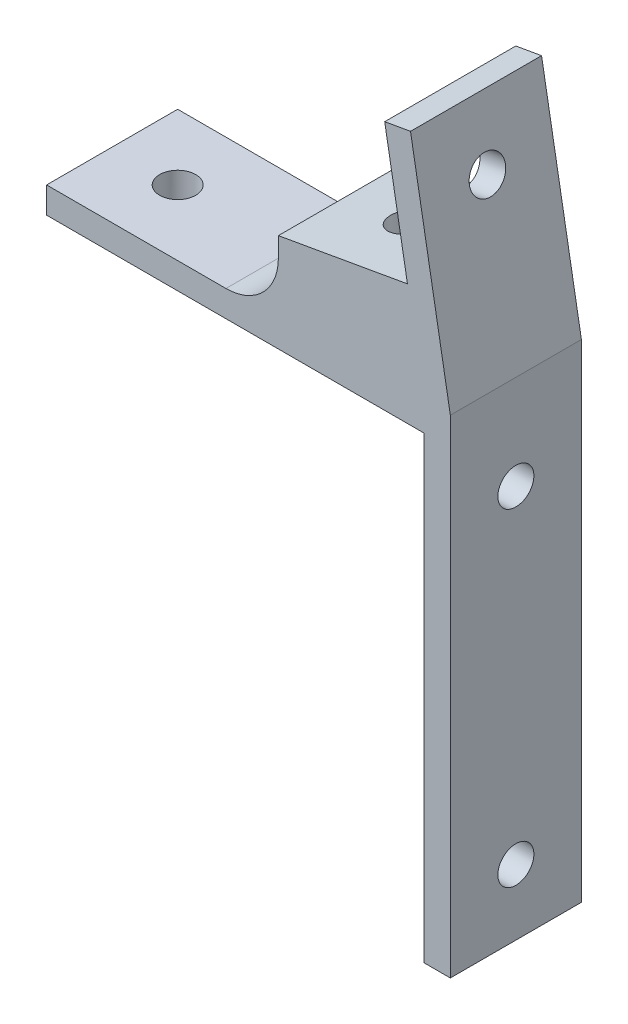
ISO-10303-21;
HEADER;
FILE_DESCRIPTION(('STEP AP214'),'2;1');
FILE_NAME('part.step','',(''),(''),'','','');
FILE_SCHEMA(('AUTOMOTIVE_DESIGN { 1 0 10303 214 1 1 1 1 }'));
ENDSEC;
DATA;
#1=APPLICATION_CONTEXT('core data for automotive mechanical design processes');
#2=APPLICATION_PROTOCOL_DEFINITION('international standard','automotive_design',2000,#1);
#3=PRODUCT_CONTEXT('',#1,'mechanical');
#4=PRODUCT('Part','Part','',(#3));
#5=PRODUCT_RELATED_PRODUCT_CATEGORY('part','',(#4));
#6=PRODUCT_DEFINITION_FORMATION('','',#4);
#7=PRODUCT_DEFINITION_CONTEXT('part definition',#1,'design');
#8=PRODUCT_DEFINITION('design','',#6,#7);
#9=PRODUCT_DEFINITION_SHAPE('','',#8);
#10=(LENGTH_UNIT() NAMED_UNIT(*) SI_UNIT(.MILLI.,.METRE.));
#11=(NAMED_UNIT(*) PLANE_ANGLE_UNIT() SI_UNIT($,.RADIAN.));
#12=(NAMED_UNIT(*) SI_UNIT($,.STERADIAN.) SOLID_ANGLE_UNIT());
#13=UNCERTAINTY_MEASURE_WITH_UNIT(LENGTH_MEASURE(1.E-05),#10,'distance_accuracy_value','');
#14=(GEOMETRIC_REPRESENTATION_CONTEXT(3) GLOBAL_UNCERTAINTY_ASSIGNED_CONTEXT((#13)) GLOBAL_UNIT_ASSIGNED_CONTEXT((#10,
#11,#12)) REPRESENTATION_CONTEXT('',''));
#15=CARTESIAN_POINT('',(0.,0.,0.));
#16=DIRECTION('',(0.,0.,1.));
#17=DIRECTION('',(1.,0.,0.));
#18=AXIS2_PLACEMENT_3D('',#15,#16,#17);
#19=CARTESIAN_POINT('',(-4.,0.,20.));
#20=DIRECTION('',(-1.,0.,0.));
#21=DIRECTION('',(0.,0.,1.));
#22=AXIS2_PLACEMENT_3D('',#19,#20,#21);
#23=PLANE('',#22);
#24=CARTESIAN_POINT('',(-4.,9.99996286389591,9.9999995));
#25=DIRECTION('',(-1.,0.,0.));
#26=DIRECTION('',(0.,0.,1.));
#27=AXIS2_PLACEMENT_3D('',#24,#25,#26);
#28=CIRCLE('',#27,2.74999594956033);
#29=CARTESIAN_POINT('',(-4.,9.99996286389591,12.7499954495603));
#30=VERTEX_POINT('',#29);
#31=EDGE_CURVE('E277',#30,#30,#28,.T.);
#32=ORIENTED_EDGE('',*,*,#31,.F.);
#33=EDGE_LOOP('',(#32));
#34=FACE_BOUND('',#33,.T.);
#35=CARTESIAN_POINT('',(-4.,59.9999776734455,9.9999995));
#36=DIRECTION('',(-1.,0.,0.));
#37=DIRECTION('',(0.,0.,1.));
#38=AXIS2_PLACEMENT_3D('',#35,#36,#37);
#39=CIRCLE('',#38,2.74999594960124);
#40=CARTESIAN_POINT('',(-4.,59.9999776734455,12.7499954496012));
#41=VERTEX_POINT('',#40);
#42=EDGE_CURVE('E156',#41,#41,#39,.T.);
#43=ORIENTED_EDGE('',*,*,#42,.F.);
#44=EDGE_LOOP('',(#43));
#45=FACE_BOUND('',#44,.T.);
#46=DIRECTION('',(0.,1.,0.));
#47=VECTOR('',#46,1.);
#48=CARTESIAN_POINT('',(-4.,0.,0.));
#49=LINE('',#48,#47);
#50=CARTESIAN_POINT('',(-4.,0.,0.));
#51=VERTEX_POINT('',#50);
#52=CARTESIAN_POINT('',(-4.,69.9999692632638,0.));
#53=VERTEX_POINT('',#52);
#54=EDGE_CURVE('E152',#51,#53,#49,.T.);
#55=ORIENTED_EDGE('',*,*,#54,.F.);
#56=DIRECTION('',(0.,0.,-1.));
#57=VECTOR('',#56,1.);
#58=CARTESIAN_POINT('',(-4.,0.,20.));
#59=LINE('',#58,#57);
#60=CARTESIAN_POINT('',(-4.,0.,20.));
#61=VERTEX_POINT('',#60);
#62=EDGE_CURVE('E11',#61,#51,#59,.T.);
#63=ORIENTED_EDGE('',*,*,#62,.F.);
#64=DIRECTION('',(0.,1.,0.));
#65=VECTOR('',#64,1.);
#66=CARTESIAN_POINT('',(-4.,0.,20.));
#67=LINE('',#66,#65);
#68=CARTESIAN_POINT('',(-4.,69.9999692632638,20.));
#69=VERTEX_POINT('',#68);
#70=EDGE_CURVE('E183',#61,#69,#67,.T.);
#71=ORIENTED_EDGE('',*,*,#70,.T.);
#72=DIRECTION('',(0.,0.,-1.));
#73=VECTOR('',#72,1.);
#74=CARTESIAN_POINT('',(-4.,69.9999692632638,20.));
#75=LINE('',#74,#73);
#76=EDGE_CURVE('E36',#69,#53,#75,.T.);
#77=ORIENTED_EDGE('',*,*,#76,.T.);
#78=EDGE_LOOP('',(#55,#63,#71,#77));
#79=FACE_BOUND('',#78,.T.);
#80=ADVANCED_FACE('F33',(#34,#45,#79),#23,.T.);
#81=CARTESIAN_POINT('',(0.,0.,20.));
#82=DIRECTION('',(0.,-1.,0.));
#83=DIRECTION('',(1.,0.,0.));
#84=AXIS2_PLACEMENT_3D('',#81,#82,#83);
#85=PLANE('',#84);
#86=DIRECTION('',(-1.,0.,0.));
#87=VECTOR('',#86,1.);
#88=CARTESIAN_POINT('',(0.,0.,0.));
#89=LINE('',#88,#87);
#90=CARTESIAN_POINT('',(0.,0.,0.));
#91=VERTEX_POINT('',#90);
#92=EDGE_CURVE('E181',#91,#51,#89,.T.);
#93=ORIENTED_EDGE('',*,*,#92,.F.);
#94=DIRECTION('',(0.,0.,-1.));
#95=VECTOR('',#94,1.);
#96=CARTESIAN_POINT('',(0.,0.,20.));
#97=LINE('',#96,#95);
#98=CARTESIAN_POINT('',(0.,0.,20.));
#99=VERTEX_POINT('',#98);
#100=EDGE_CURVE('E42',#99,#91,#97,.T.);
#101=ORIENTED_EDGE('',*,*,#100,.F.);
#102=DIRECTION('',(-1.,0.,0.));
#103=VECTOR('',#102,1.);
#104=CARTESIAN_POINT('',(0.,0.,20.));
#105=LINE('',#104,#103);
#106=EDGE_CURVE('E147',#99,#61,#105,.T.);
#107=ORIENTED_EDGE('',*,*,#106,.T.);
#108=ORIENTED_EDGE('',*,*,#62,.T.);
#109=EDGE_LOOP('',(#93,#101,#107,#108));
#110=FACE_BOUND('',#109,.T.);
#111=ADVANCED_FACE('F205',(#110),#85,.T.);
#112=CARTESIAN_POINT('',(0.,74.3796608746191,20.));
#113=DIRECTION('',(1.,0.,0.));
#114=DIRECTION('',(0.,1.,0.));
#115=AXIS2_PLACEMENT_3D('',#112,#113,#114);
#116=PLANE('',#115);
#117=CARTESIAN_POINT('',(0.,9.99996286389591,9.9999995));
#118=DIRECTION('',(1.,0.,0.));
#119=DIRECTION('',(0.,1.,0.));
#120=AXIS2_PLACEMENT_3D('',#117,#118,#119);
#121=CIRCLE('',#120,2.74999594956033);
#122=CARTESIAN_POINT('',(0.,12.7499588134562,9.9999995));
#123=VERTEX_POINT('',#122);
#124=EDGE_CURVE('E276',#123,#123,#121,.F.);
#125=ORIENTED_EDGE('',*,*,#124,.T.);
#126=EDGE_LOOP('',(#125));
#127=FACE_BOUND('',#126,.T.);
#128=CARTESIAN_POINT('',(0.,59.9999776734455,9.9999995));
#129=DIRECTION('',(1.,0.,0.));
#130=DIRECTION('',(0.,1.,0.));
#131=AXIS2_PLACEMENT_3D('',#128,#129,#130);
#132=CIRCLE('',#131,2.74999594960124);
#133=CARTESIAN_POINT('',(0.,62.7499736230467,9.9999995));
#134=VERTEX_POINT('',#133);
#135=EDGE_CURVE('E280',#134,#134,#132,.F.);
#136=ORIENTED_EDGE('',*,*,#135,.T.);
#137=EDGE_LOOP('',(#136));
#138=FACE_BOUND('',#137,.T.);
#139=DIRECTION('',(0.,-1.,0.));
#140=VECTOR('',#139,1.);
#141=CARTESIAN_POINT('',(0.,74.3796608746191,0.));
#142=LINE('',#141,#140);
#143=CARTESIAN_POINT('',(0.,74.3796608746191,0.));
#144=VERTEX_POINT('',#143);
#145=EDGE_CURVE('E132',#144,#91,#142,.T.);
#146=ORIENTED_EDGE('',*,*,#145,.F.);
#147=DIRECTION('',(0.,0.,-1.));
#148=VECTOR('',#147,1.);
#149=CARTESIAN_POINT('',(0.,74.3796608746191,20.));
#150=LINE('',#149,#148);
#151=CARTESIAN_POINT('',(0.,74.3796608746191,20.));
#152=VERTEX_POINT('',#151);
#153=EDGE_CURVE('E126',#152,#144,#150,.T.);
#154=ORIENTED_EDGE('',*,*,#153,.F.);
#155=DIRECTION('',(0.,-1.,0.));
#156=VECTOR('',#155,1.);
#157=CARTESIAN_POINT('',(0.,74.3796608746191,20.));
#158=LINE('',#157,#156);
#159=EDGE_CURVE('E130',#152,#99,#158,.T.);
#160=ORIENTED_EDGE('',*,*,#159,.T.);
#161=ORIENTED_EDGE('',*,*,#100,.T.);
#162=EDGE_LOOP('',(#146,#154,#160,#161));
#163=FACE_BOUND('',#162,.T.);
#164=ADVANCED_FACE('F128',(#127,#138,#163),#116,.T.);
#165=CARTESIAN_POINT('',(0.,74.3796608746191,20.));
#166=DIRECTION('',(-0.984807753012207,-0.173648177666935,0.));
#167=DIRECTION('',(0.173648177666935,-0.984807753012207,0.));
#168=AXIS2_PLACEMENT_3D('',#165,#166,#167);
#169=PLANE('',#168);
#170=CARTESIAN_POINT('',(-4.34120444167338,98.9998546999244,10.));
#171=DIRECTION('',(0.984807753012207,0.173648177666935,0.));
#172=DIRECTION('',(-0.173648177666935,0.984807753012207,0.));
#173=AXIS2_PLACEMENT_3D('',#170,#171,#172);
#174=CIRCLE('',#173,2.75);
#175=CARTESIAN_POINT('',(-4.81873693025745,101.708076020708,10.));
#176=VERTEX_POINT('',#175);
#177=EDGE_CURVE('E265',#176,#176,#174,.T.);
#178=ORIENTED_EDGE('',*,*,#177,.F.);
#179=EDGE_LOOP('',(#178));
#180=FACE_BOUND('',#179,.T.);
#181=DIRECTION('',(-0.173648177666935,0.984807753012207,0.));
#182=VECTOR('',#181,1.);
#183=CARTESIAN_POINT('',(0.,74.3796608746191,0.));
#184=LINE('',#183,#182);
#185=CARTESIAN_POINT('',(-6.07768621834272,108.847932230046,0.));
#186=VERTEX_POINT('',#185);
#187=EDGE_CURVE('E178',#144,#186,#184,.T.);
#188=ORIENTED_EDGE('',*,*,#187,.T.);
#189=DIRECTION('',(0.,0.,-1.));
#190=VECTOR('',#189,1.);
#191=CARTESIAN_POINT('',(-6.07768621834272,108.847932230046,20.));
#192=LINE('',#191,#190);
#193=CARTESIAN_POINT('',(-6.07768621834272,108.847932230046,20.));
#194=VERTEX_POINT('',#193);
#195=EDGE_CURVE('E136',#194,#186,#192,.T.);
#196=ORIENTED_EDGE('',*,*,#195,.F.);
#197=DIRECTION('',(-0.173648177666935,0.984807753012207,0.));
#198=VECTOR('',#197,1.);
#199=CARTESIAN_POINT('',(0.,74.3796608746191,20.));
#200=LINE('',#199,#198);
#201=EDGE_CURVE('E139',#152,#194,#200,.T.);
#202=ORIENTED_EDGE('',*,*,#201,.F.);
#203=ORIENTED_EDGE('',*,*,#153,.T.);
#204=EDGE_LOOP('',(#188,#196,#202,#203));
#205=FACE_BOUND('',#204,.T.);
#206=ADVANCED_FACE('F140',(#180,#205),#169,.F.);
#207=CARTESIAN_POINT('',(-10.0169172303916,108.153339519379,20.));
#208=DIRECTION('',(-0.173648177666931,0.984807753012208,0.));
#209=DIRECTION('',(-0.984807753012208,-0.173648177666931,0.));
#210=AXIS2_PLACEMENT_3D('',#207,#208,#209);
#211=PLANE('',#210);
#212=DIRECTION('',(0.984807753012208,0.173648177666931,0.));
#213=VECTOR('',#212,1.);
#214=CARTESIAN_POINT('',(-10.0169172303916,108.153339519379,0.));
#215=LINE('',#214,#213);
#216=CARTESIAN_POINT('',(-10.0169172303916,108.153339519379,0.));
#217=VERTEX_POINT('',#216);
#218=EDGE_CURVE('E175',#217,#186,#215,.T.);
#219=ORIENTED_EDGE('',*,*,#218,.F.);
#220=DIRECTION('',(0.,0.,-1.));
#221=VECTOR('',#220,1.);
#222=CARTESIAN_POINT('',(-10.0169172303916,108.153339519379,20.));
#223=LINE('',#222,#221);
#224=CARTESIAN_POINT('',(-10.0169172303916,108.153339519379,20.));
#225=VERTEX_POINT('',#224);
#226=EDGE_CURVE('E187',#225,#217,#223,.T.);
#227=ORIENTED_EDGE('',*,*,#226,.F.);
#228=DIRECTION('',(0.984807753012208,0.173648177666931,0.));
#229=VECTOR('',#228,1.);
#230=CARTESIAN_POINT('',(-10.0169172303916,108.153339519379,20.));
#231=LINE('',#230,#229);
#232=EDGE_CURVE('E144',#225,#194,#231,.T.);
#233=ORIENTED_EDGE('',*,*,#232,.T.);
#234=ORIENTED_EDGE('',*,*,#195,.T.);
#235=EDGE_LOOP('',(#219,#227,#233,#234));
#236=FACE_BOUND('',#235,.T.);
#237=ADVANCED_FACE('F220',(#236),#211,.T.);
#238=CARTESIAN_POINT('',(-10.0169172303916,108.153339519379,20.));
#239=DIRECTION('',(0.984807753012207,0.173648177666935,0.));
#240=DIRECTION('',(-0.173648177666935,0.984807753012207,0.));
#241=AXIS2_PLACEMENT_3D('',#238,#239,#240);
#242=PLANE('',#241);
#243=CARTESIAN_POINT('',(-8.28043545372222,98.3052619892566,10.));
#244=DIRECTION('',(0.984807753012207,0.173648177666935,0.));
#245=DIRECTION('',(-0.173648177666935,0.984807753012207,0.));
#246=AXIS2_PLACEMENT_3D('',#243,#244,#245);
#247=CIRCLE('',#246,2.75);
#248=CARTESIAN_POINT('',(-8.75796794230629,101.01348331004,10.));
#249=VERTEX_POINT('',#248);
#250=EDGE_CURVE('E273',#249,#249,#247,.F.);
#251=ORIENTED_EDGE('',*,*,#250,.F.);
#252=EDGE_LOOP('',(#251));
#253=FACE_BOUND('',#252,.T.);
#254=DIRECTION('',(0.173648177666935,-0.984807753012207,0.));
#255=VECTOR('',#254,1.);
#256=CARTESIAN_POINT('',(-10.0169172303916,108.153339519379,0.));
#257=LINE('',#256,#255);
#258=CARTESIAN_POINT('',(-6.54395367705286,88.4571844591345,0.));
#259=VERTEX_POINT('',#258);
#260=EDGE_CURVE('E173',#217,#259,#257,.T.);
#261=ORIENTED_EDGE('',*,*,#260,.T.);
#262=DIRECTION('',(0.,0.,-1.));
#263=VECTOR('',#262,1.);
#264=CARTESIAN_POINT('',(-6.54395367705286,88.4571844591345,20.));
#265=LINE('',#264,#263);
#266=CARTESIAN_POINT('',(-6.54395367705286,88.4571844591345,20.));
#267=VERTEX_POINT('',#266);
#268=EDGE_CURVE('E189',#267,#259,#265,.T.);
#269=ORIENTED_EDGE('',*,*,#268,.F.);
#270=DIRECTION('',(0.173648177666935,-0.984807753012207,0.));
#271=VECTOR('',#270,1.);
#272=CARTESIAN_POINT('',(-10.0169172303916,108.153339519379,20.));
#273=LINE('',#272,#271);
#274=EDGE_CURVE('E303',#225,#267,#273,.T.);
#275=ORIENTED_EDGE('',*,*,#274,.F.);
#276=ORIENTED_EDGE('',*,*,#226,.T.);
#277=EDGE_LOOP('',(#261,#269,#275,#276));
#278=FACE_BOUND('',#277,.T.);
#279=ADVANCED_FACE('F224',(#253,#278),#242,.F.);
#280=CARTESIAN_POINT('',(-6.54395367705286,88.4571844591345,20.));
#281=DIRECTION('',(0.173648177666935,-0.984807753012207,0.));
#282=DIRECTION('',(0.984807753012207,0.173648177666935,0.));
#283=AXIS2_PLACEMENT_3D('',#280,#281,#282);
#284=PLANE('',#283);
#285=CARTESIAN_POINT('',(-16.3920312071749,86.7207026824652,10.));
#286=DIRECTION('',(-0.173648177666935,0.984807753012207,0.));
#287=DIRECTION('',(-0.984807753012207,-0.173648177666935,0.));
#288=AXIS2_PLACEMENT_3D('',#285,#286,#287);
#289=CIRCLE('',#288,2.75);
#290=CARTESIAN_POINT('',(-19.1002525279585,86.2431701938811,10.));
#291=VERTEX_POINT('',#290);
#292=EDGE_CURVE('E262',#291,#291,#289,.T.);
#293=ORIENTED_EDGE('',*,*,#292,.F.);
#294=EDGE_LOOP('',(#293));
#295=FACE_BOUND('',#294,.T.);
#296=DIRECTION('',(-0.984807753012207,-0.173648177666935,0.));
#297=VECTOR('',#296,1.);
#298=CARTESIAN_POINT('',(-6.54395367705286,88.4571844591345,0.));
#299=LINE('',#298,#297);
#300=CARTESIAN_POINT('',(-26.240108737297,84.9842209057958,0.));
#301=VERTEX_POINT('',#300);
#302=EDGE_CURVE('E171',#259,#301,#299,.T.);
#303=ORIENTED_EDGE('',*,*,#302,.T.);
#304=DIRECTION('',(0.,0.,-1.));
#305=VECTOR('',#304,1.);
#306=CARTESIAN_POINT('',(-26.240108737297,84.9842209057958,20.));
#307=LINE('',#306,#305);
#308=CARTESIAN_POINT('',(-26.240108737297,84.9842209057958,20.));
#309=VERTEX_POINT('',#308);
#310=EDGE_CURVE('E192',#309,#301,#307,.T.);
#311=ORIENTED_EDGE('',*,*,#310,.F.);
#312=DIRECTION('',(-0.984807753012207,-0.173648177666935,0.));
#313=VECTOR('',#312,1.);
#314=CARTESIAN_POINT('',(-6.54395367705286,88.4571844591345,20.));
#315=LINE('',#314,#313);
#316=EDGE_CURVE('E301',#267,#309,#315,.T.);
#317=ORIENTED_EDGE('',*,*,#316,.F.);
#318=ORIENTED_EDGE('',*,*,#268,.T.);
#319=EDGE_LOOP('',(#303,#311,#317,#318));
#320=FACE_BOUND('',#319,.T.);
#321=ADVANCED_FACE('F228',(#295,#320),#284,.F.);
#322=CARTESIAN_POINT('',(-26.240108737297,84.9842209057958,20.));
#323=DIRECTION('',(1.,0.,0.));
#324=DIRECTION('',(0.,0.,-1.));
#325=AXIS2_PLACEMENT_3D('',#322,#323,#324);
#326=PLANE('',#325);
#327=DIRECTION('',(0.,-1.,0.));
#328=VECTOR('',#327,1.);
#329=CARTESIAN_POINT('',(-26.240108737297,84.9842209057958,0.));
#330=LINE('',#329,#328);
#331=CARTESIAN_POINT('',(-26.240108737297,81.9999692632638,0.));
#332=VERTEX_POINT('',#331);
#333=EDGE_CURVE('E168',#301,#332,#330,.T.);
#334=ORIENTED_EDGE('',*,*,#333,.T.);
#335=DIRECTION('',(0.,0.,-1.));
#336=VECTOR('',#335,1.);
#337=CARTESIAN_POINT('',(-26.240108737297,81.9999692632638,20.));
#338=LINE('',#337,#336);
#339=CARTESIAN_POINT('',(-26.240108737297,81.9999692632638,20.));
#340=VERTEX_POINT('',#339);
#341=EDGE_CURVE('E195',#340,#332,#338,.T.);
#342=ORIENTED_EDGE('',*,*,#341,.F.);
#343=DIRECTION('',(0.,-1.,0.));
#344=VECTOR('',#343,1.);
#345=CARTESIAN_POINT('',(-26.240108737297,84.9842209057958,20.));
#346=LINE('',#345,#344);
#347=EDGE_CURVE('E299',#309,#340,#346,.T.);
#348=ORIENTED_EDGE('',*,*,#347,.F.);
#349=ORIENTED_EDGE('',*,*,#310,.T.);
#350=EDGE_LOOP('',(#334,#342,#348,#349));
#351=FACE_BOUND('',#350,.T.);
#352=ADVANCED_FACE('F232',(#351),#326,.F.);
#353=CARTESIAN_POINT('',(-34.240108737297,81.9999692632638,20.));
#354=DIRECTION('',(0.,0.,-1.));
#355=DIRECTION('',(-1.,0.,0.));
#356=AXIS2_PLACEMENT_3D('',#353,#354,#355);
#357=CYLINDRICAL_SURFACE('',#356,8.00000000000001);
#358=CARTESIAN_POINT('',(-34.240108737297,81.9999692632638,0.));
#359=DIRECTION('',(0.,0.,1.));
#360=DIRECTION('',(1.,0.,0.));
#361=AXIS2_PLACEMENT_3D('',#358,#359,#360);
#362=CIRCLE('',#361,8.00000000000001);
#363=CARTESIAN_POINT('',(-34.2401087372971,73.9999692632638,0.));
#364=VERTEX_POINT('',#363);
#365=EDGE_CURVE('E165',#364,#332,#362,.T.);
#366=ORIENTED_EDGE('',*,*,#365,.F.);
#367=DIRECTION('',(0.,0.,-1.));
#368=VECTOR('',#367,1.);
#369=CARTESIAN_POINT('',(-34.2401087372971,73.9999692632638,20.));
#370=LINE('',#369,#368);
#371=CARTESIAN_POINT('',(-34.2401087372971,73.9999692632638,20.));
#372=VERTEX_POINT('',#371);
#373=EDGE_CURVE('E197',#372,#364,#370,.T.);
#374=ORIENTED_EDGE('',*,*,#373,.F.);
#375=CARTESIAN_POINT('',(-34.240108737297,81.9999692632638,20.));
#376=DIRECTION('',(0.,0.,1.));
#377=DIRECTION('',(1.,0.,0.));
#378=AXIS2_PLACEMENT_3D('',#375,#376,#377);
#379=CIRCLE('',#378,8.00000000000001);
#380=EDGE_CURVE('E296',#372,#340,#379,.T.);
#381=ORIENTED_EDGE('',*,*,#380,.T.);
#382=ORIENTED_EDGE('',*,*,#341,.T.);
#383=EDGE_LOOP('',(#366,#374,#381,#382));
#384=FACE_BOUND('',#383,.T.);
#385=ADVANCED_FACE('F236',(#384),#357,.F.);
#386=CARTESIAN_POINT('',(-61.608001,73.9999692632638,20.));
#387=DIRECTION('',(0.,1.,0.));
#388=DIRECTION('',(0.,0.,1.));
#389=AXIS2_PLACEMENT_3D('',#386,#387,#388);
#390=PLANE('',#389);
#391=CARTESIAN_POINT('',(-51.608001,73.9999692632638,10.));
#392=DIRECTION('',(0.,1.,0.));
#393=DIRECTION('',(0.,0.,1.));
#394=AXIS2_PLACEMENT_3D('',#391,#392,#393);
#395=CIRCLE('',#394,2.75);
#396=CARTESIAN_POINT('',(-51.608001,73.9999692632638,12.75));
#397=VERTEX_POINT('',#396);
#398=EDGE_CURVE('E261',#397,#397,#395,.T.);
#399=ORIENTED_EDGE('',*,*,#398,.F.);
#400=EDGE_LOOP('',(#399));
#401=FACE_BOUND('',#400,.T.);
#402=DIRECTION('',(1.,0.,0.));
#403=VECTOR('',#402,1.);
#404=CARTESIAN_POINT('',(-61.608001,73.9999692632638,0.));
#405=LINE('',#404,#403);
#406=CARTESIAN_POINT('',(-61.608001,73.9999692632638,0.));
#407=VERTEX_POINT('',#406);
#408=EDGE_CURVE('E162',#407,#364,#405,.T.);
#409=ORIENTED_EDGE('',*,*,#408,.F.);
#410=DIRECTION('',(0.,0.,-1.));
#411=VECTOR('',#410,1.);
#412=CARTESIAN_POINT('',(-61.608001,73.9999692632638,20.));
#413=LINE('',#412,#411);
#414=CARTESIAN_POINT('',(-61.608001,73.9999692632638,20.));
#415=VERTEX_POINT('',#414);
#416=EDGE_CURVE('E199',#415,#407,#413,.T.);
#417=ORIENTED_EDGE('',*,*,#416,.F.);
#418=DIRECTION('',(1.,0.,0.));
#419=VECTOR('',#418,1.);
#420=CARTESIAN_POINT('',(-61.608001,73.9999692632638,20.));
#421=LINE('',#420,#419);
#422=EDGE_CURVE('E293',#415,#372,#421,.T.);
#423=ORIENTED_EDGE('',*,*,#422,.T.);
#424=ORIENTED_EDGE('',*,*,#373,.T.);
#425=EDGE_LOOP('',(#409,#417,#423,#424));
#426=FACE_BOUND('',#425,.T.);
#427=ADVANCED_FACE('F240',(#401,#426),#390,.T.);
#428=CARTESIAN_POINT('',(-61.608001,69.9999692632638,20.));
#429=DIRECTION('',(-1.,0.,0.));
#430=DIRECTION('',(0.,0.,1.));
#431=AXIS2_PLACEMENT_3D('',#428,#429,#430);
#432=PLANE('',#431);
#433=DIRECTION('',(0.,1.,0.));
#434=VECTOR('',#433,1.);
#435=CARTESIAN_POINT('',(-61.608001,69.9999692632638,0.));
#436=LINE('',#435,#434);
#437=CARTESIAN_POINT('',(-61.608001,69.9999692632638,0.));
#438=VERTEX_POINT('',#437);
#439=EDGE_CURVE('E159',#438,#407,#436,.T.);
#440=ORIENTED_EDGE('',*,*,#439,.F.);
#441=DIRECTION('',(0.,0.,-1.));
#442=VECTOR('',#441,1.);
#443=CARTESIAN_POINT('',(-61.608001,69.9999692632638,20.));
#444=LINE('',#443,#442);
#445=CARTESIAN_POINT('',(-61.608001,69.9999692632638,20.));
#446=VERTEX_POINT('',#445);
#447=EDGE_CURVE('E200',#446,#438,#444,.T.);
#448=ORIENTED_EDGE('',*,*,#447,.F.);
#449=DIRECTION('',(0.,1.,0.));
#450=VECTOR('',#449,1.);
#451=CARTESIAN_POINT('',(-61.608001,69.9999692632638,20.));
#452=LINE('',#451,#450);
#453=EDGE_CURVE('E290',#446,#415,#452,.T.);
#454=ORIENTED_EDGE('',*,*,#453,.T.);
#455=ORIENTED_EDGE('',*,*,#416,.T.);
#456=EDGE_LOOP('',(#440,#448,#454,#455));
#457=FACE_BOUND('',#456,.T.);
#458=ADVANCED_FACE('F244',(#457),#432,.T.);
#459=CARTESIAN_POINT('',(-4.,69.9999692632638,20.));
#460=DIRECTION('',(0.,-1.,0.));
#461=DIRECTION('',(0.,0.,-1.));
#462=AXIS2_PLACEMENT_3D('',#459,#460,#461);
#463=PLANE('',#462);
#464=CARTESIAN_POINT('',(-13.4437147681359,69.9999692632638,10.));
#465=DIRECTION('',(0.,-1.,0.));
#466=DIRECTION('',(-1.,0.,0.));
#467=AXIS2_PLACEMENT_3D('',#464,#465,#466);
#468=ELLIPSE('',#467,5.07713305942873,5.);
#469=CARTESIAN_POINT('',(-18.5208478275647,69.9999692632638,10.));
#470=VERTEX_POINT('',#469);
#471=EDGE_CURVE('E256',#470,#470,#468,.F.);
#472=ORIENTED_EDGE('',*,*,#471,.T.);
#473=EDGE_LOOP('',(#472));
#474=FACE_BOUND('',#473,.T.);
#475=CARTESIAN_POINT('',(-51.608001,69.9999692632638,10.));
#476=DIRECTION('',(0.,-1.,0.));
#477=DIRECTION('',(0.,0.,-1.));
#478=AXIS2_PLACEMENT_3D('',#475,#476,#477);
#479=CIRCLE('',#478,2.75);
#480=CARTESIAN_POINT('',(-51.608001,69.9999692632638,7.25));
#481=VERTEX_POINT('',#480);
#482=EDGE_CURVE('E259',#481,#481,#479,.F.);
#483=ORIENTED_EDGE('',*,*,#482,.T.);
#484=EDGE_LOOP('',(#483));
#485=FACE_BOUND('',#484,.T.);
#486=DIRECTION('',(-1.,0.,0.));
#487=VECTOR('',#486,1.);
#488=CARTESIAN_POINT('',(-4.,69.9999692632638,0.));
#489=LINE('',#488,#487);
#490=EDGE_CURVE('E155',#53,#438,#489,.T.);
#491=ORIENTED_EDGE('',*,*,#490,.F.);
#492=ORIENTED_EDGE('',*,*,#76,.F.);
#493=DIRECTION('',(-1.,0.,0.));
#494=VECTOR('',#493,1.);
#495=CARTESIAN_POINT('',(-4.,69.9999692632638,20.));
#496=LINE('',#495,#494);
#497=EDGE_CURVE('E288',#69,#446,#496,.T.);
#498=ORIENTED_EDGE('',*,*,#497,.T.);
#499=ORIENTED_EDGE('',*,*,#447,.T.);
#500=EDGE_LOOP('',(#491,#492,#498,#499));
#501=FACE_BOUND('',#500,.T.);
#502=ADVANCED_FACE('F202',(#474,#485,#501),#463,.T.);
#503=CARTESIAN_POINT('',(-34.240108737297,81.9999692632638,20.));
#504=DIRECTION('',(0.,0.,1.));
#505=DIRECTION('',(1.,0.,0.));
#506=AXIS2_PLACEMENT_3D('',#503,#504,#505);
#507=PLANE('',#506);
#508=ORIENTED_EDGE('',*,*,#70,.F.);
#509=ORIENTED_EDGE('',*,*,#106,.F.);
#510=ORIENTED_EDGE('',*,*,#159,.F.);
#511=ORIENTED_EDGE('',*,*,#201,.T.);
#512=ORIENTED_EDGE('',*,*,#232,.F.);
#513=ORIENTED_EDGE('',*,*,#274,.T.);
#514=ORIENTED_EDGE('',*,*,#316,.T.);
#515=ORIENTED_EDGE('',*,*,#347,.T.);
#516=ORIENTED_EDGE('',*,*,#380,.F.);
#517=ORIENTED_EDGE('',*,*,#422,.F.);
#518=ORIENTED_EDGE('',*,*,#453,.F.);
#519=ORIENTED_EDGE('',*,*,#497,.F.);
#520=EDGE_LOOP('',(#508,#509,#510,#511,#512,#513,#514,#515,#516,#517,#518,#519));
#521=FACE_BOUND('',#520,.T.);
#522=ADVANCED_FACE('F146',(#521),#507,.T.);
#523=CARTESIAN_POINT('',(-34.240108737297,81.9999692632638,0.));
#524=DIRECTION('',(0.,0.,1.));
#525=DIRECTION('',(1.,0.,0.));
#526=AXIS2_PLACEMENT_3D('',#523,#524,#525);
#527=PLANE('',#526);
#528=ORIENTED_EDGE('',*,*,#54,.T.);
#529=ORIENTED_EDGE('',*,*,#490,.T.);
#530=ORIENTED_EDGE('',*,*,#439,.T.);
#531=ORIENTED_EDGE('',*,*,#408,.T.);
#532=ORIENTED_EDGE('',*,*,#365,.T.);
#533=ORIENTED_EDGE('',*,*,#333,.F.);
#534=ORIENTED_EDGE('',*,*,#302,.F.);
#535=ORIENTED_EDGE('',*,*,#260,.F.);
#536=ORIENTED_EDGE('',*,*,#218,.T.);
#537=ORIENTED_EDGE('',*,*,#187,.F.);
#538=ORIENTED_EDGE('',*,*,#145,.T.);
#539=ORIENTED_EDGE('',*,*,#92,.T.);
#540=EDGE_LOOP('',(#528,#529,#530,#531,#532,#533,#534,#535,#536,#537,#538,#539));
#541=FACE_BOUND('',#540,.T.);
#542=ADVANCED_FACE('F204',(#541),#527,.F.);
#543=CARTESIAN_POINT('',(0.00100000000000013,59.9999776734455,9.9999995));
#544=DIRECTION('',(-1.,0.,0.));
#545=DIRECTION('',(0.,0.,1.));
#546=AXIS2_PLACEMENT_3D('',#543,#544,#545);
#547=CYLINDRICAL_SURFACE('',#546,2.74999594960124);
#548=ORIENTED_EDGE('',*,*,#135,.F.);
#549=EDGE_LOOP('',(#548));
#550=FACE_BOUND('',#549,.T.);
#551=ORIENTED_EDGE('',*,*,#42,.T.);
#552=EDGE_LOOP('',(#551));
#553=FACE_BOUND('',#552,.T.);
#554=ADVANCED_FACE('F325',(#550,#553),#547,.F.);
#555=CARTESIAN_POINT('',(0.00100000000000013,9.99996286389591,9.9999995));
#556=DIRECTION('',(-1.,0.,0.));
#557=DIRECTION('',(0.,0.,1.));
#558=AXIS2_PLACEMENT_3D('',#555,#556,#557);
#559=CYLINDRICAL_SURFACE('',#558,2.74999594956033);
#560=ORIENTED_EDGE('',*,*,#124,.F.);
#561=EDGE_LOOP('',(#560));
#562=FACE_BOUND('',#561,.T.);
#563=ORIENTED_EDGE('',*,*,#31,.T.);
#564=EDGE_LOOP('',(#563));
#565=FACE_BOUND('',#564,.T.);
#566=ADVANCED_FACE('F328',(#562,#565),#559,.F.);
#567=CARTESIAN_POINT('',(-76.812308895017,86.2212436630581,10.));
#568=DIRECTION('',(0.984807753012207,0.173648177666935,0.));
#569=DIRECTION('',(-0.173648177666935,0.984807753012207,0.));
#570=AXIS2_PLACEMENT_3D('',#567,#568,#569);
#571=CYLINDRICAL_SURFACE('',#570,2.75);
#572=ORIENTED_EDGE('',*,*,#177,.T.);
#573=EDGE_LOOP('',(#572));
#574=FACE_BOUND('',#573,.T.);
#575=ORIENTED_EDGE('',*,*,#250,.T.);
#576=EDGE_LOOP('',(#575));
#577=FACE_BOUND('',#576,.T.);
#578=ADVANCED_FACE('F336',(#574,#577),#571,.F.);
#579=CARTESIAN_POINT('',(-51.608001,-0.001000000000001,10.));
#580=DIRECTION('',(0.,1.,0.));
#581=DIRECTION('',(0.,0.,1.));
#582=AXIS2_PLACEMENT_3D('',#579,#580,#581);
#583=CYLINDRICAL_SURFACE('',#582,2.75);
#584=ORIENTED_EDGE('',*,*,#482,.F.);
#585=EDGE_LOOP('',(#584));
#586=FACE_BOUND('',#585,.T.);
#587=ORIENTED_EDGE('',*,*,#398,.T.);
#588=EDGE_LOOP('',(#587));
#589=FACE_BOUND('',#588,.T.);
#590=ADVANCED_FACE('F342',(#586,#589),#583,.F.);
#591=CARTESIAN_POINT('',(-15.6974384965072,82.7814716704164,10.));
#592=DIRECTION('',(-0.173648177666935,0.984807753012207,0.));
#593=DIRECTION('',(-0.984807753012207,-0.173648177666935,0.));
#594=AXIS2_PLACEMENT_3D('',#591,#592,#593);
#595=CYLINDRICAL_SURFACE('',#594,2.75);
#596=CARTESIAN_POINT('',(-15.6974384965072,82.7814716704164,10.));
#597=DIRECTION('',(-0.173648177666935,0.984807753012207,0.));
#598=DIRECTION('',(-0.984807753012207,-0.173648177666935,0.));
#599=AXIS2_PLACEMENT_3D('',#596,#597,#598);
#600=CIRCLE('',#599,2.75);
#601=CARTESIAN_POINT('',(-18.4056598172908,82.3039391818323,10.));
#602=VERTEX_POINT('',#601);
#603=EDGE_CURVE('E268',#602,#602,#600,.F.);
#604=ORIENTED_EDGE('',*,*,#603,.T.);
#605=EDGE_LOOP('',(#604));
#606=FACE_BOUND('',#605,.T.);
#607=ORIENTED_EDGE('',*,*,#292,.T.);
#608=EDGE_LOOP('',(#607));
#609=FACE_BOUND('',#608,.T.);
#610=ADVANCED_FACE('F346',(#606,#609),#595,.F.);
#611=CARTESIAN_POINT('',(-15.6974384965072,82.7814716704164,10.));
#612=DIRECTION('',(-0.173648177666935,0.984807753012207,0.));
#613=DIRECTION('',(-0.984807753012207,-0.173648177666935,0.));
#614=AXIS2_PLACEMENT_3D('',#611,#612,#613);
#615=PLANE('',#614);
#616=CARTESIAN_POINT('',(-15.6974384965072,82.7814716704164,10.));
#617=DIRECTION('',(-0.173648177666935,0.984807753012207,0.));
#618=DIRECTION('',(-0.984807753012207,-0.173648177666935,0.));
#619=AXIS2_PLACEMENT_3D('',#616,#617,#618);
#620=CIRCLE('',#619,5.);
#621=CARTESIAN_POINT('',(-20.6214772615682,81.9132307820817,10.));
#622=VERTEX_POINT('',#621);
#623=EDGE_CURVE('E362',#622,#622,#620,.T.);
#624=ORIENTED_EDGE('',*,*,#623,.F.);
#625=EDGE_LOOP('',(#624));
#626=FACE_BOUND('',#625,.T.);
#627=ORIENTED_EDGE('',*,*,#603,.F.);
#628=EDGE_LOOP('',(#627));
#629=FACE_BOUND('',#628,.T.);
#630=ADVANCED_FACE('F349',(#626,#629),#615,.F.);
#631=CARTESIAN_POINT('',(-1.06743624198335,-0.189394136628454,10.));
#632=DIRECTION('',(-0.173648177666935,0.984807753012207,0.));
#633=DIRECTION('',(-0.984807753012207,-0.173648177666935,0.));
#634=AXIS2_PLACEMENT_3D('',#631,#632,#633);
#635=CYLINDRICAL_SURFACE('',#634,5.);
#636=ORIENTED_EDGE('',*,*,#471,.F.);
#637=EDGE_LOOP('',(#636));
#638=FACE_BOUND('',#637,.T.);
#639=ORIENTED_EDGE('',*,*,#623,.T.);
#640=EDGE_LOOP('',(#639));
#641=FACE_BOUND('',#640,.T.);
#642=ADVANCED_FACE('F351',(#638,#641),#635,.F.);
#643=CLOSED_SHELL('',(#80,#111,#164,#206,#237,#279,#321,#352,#385,#427,#458,#502,#522,#542,#554,
#566,#578,#590,#610,#630,#642));
#644=MANIFOLD_SOLID_BREP('B2',#643);
#645=ADVANCED_BREP_SHAPE_REPRESENTATION('',(#18,#644),#14);
#646=SHAPE_DEFINITION_REPRESENTATION(#9,#645);
ENDSEC;
END-ISO-10303-21;
